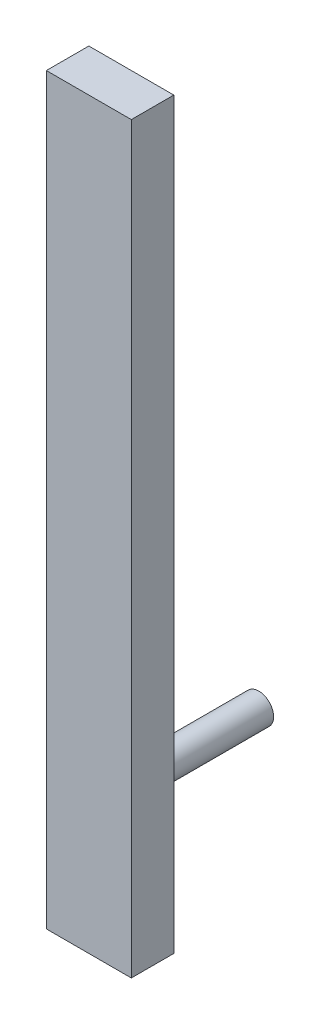
ISO-10303-21;
HEADER;
FILE_DESCRIPTION(('STEP AP214'),'2;1');
FILE_NAME('part.step','',(''),(''),'','','');
FILE_SCHEMA(('AUTOMOTIVE_DESIGN { 1 0 10303 214 1 1 1 1 }'));
ENDSEC;
DATA;
#1=APPLICATION_CONTEXT('core data for automotive mechanical design processes');
#2=APPLICATION_PROTOCOL_DEFINITION('international standard','automotive_design',2000,#1);
#3=PRODUCT_CONTEXT('',#1,'mechanical');
#4=PRODUCT('Part','Part','',(#3));
#5=PRODUCT_RELATED_PRODUCT_CATEGORY('part','',(#4));
#6=PRODUCT_DEFINITION_FORMATION('','',#4);
#7=PRODUCT_DEFINITION_CONTEXT('part definition',#1,'design');
#8=PRODUCT_DEFINITION('design','',#6,#7);
#9=PRODUCT_DEFINITION_SHAPE('','',#8);
#10=(LENGTH_UNIT() NAMED_UNIT(*) SI_UNIT(.MILLI.,.METRE.));
#11=(NAMED_UNIT(*) PLANE_ANGLE_UNIT() SI_UNIT($,.RADIAN.));
#12=(NAMED_UNIT(*) SI_UNIT($,.STERADIAN.) SOLID_ANGLE_UNIT());
#13=UNCERTAINTY_MEASURE_WITH_UNIT(LENGTH_MEASURE(1.E-05),#10,'distance_accuracy_value','');
#14=(GEOMETRIC_REPRESENTATION_CONTEXT(3) GLOBAL_UNCERTAINTY_ASSIGNED_CONTEXT((#13)) GLOBAL_UNIT_ASSIGNED_CONTEXT((#10,
#11,#12)) REPRESENTATION_CONTEXT('',''));
#15=CARTESIAN_POINT('',(0.,0.,0.));
#16=DIRECTION('',(0.,0.,1.));
#17=DIRECTION('',(1.,0.,0.));
#18=AXIS2_PLACEMENT_3D('',#15,#16,#17);
#19=CARTESIAN_POINT('',(161.317621290691,289.5,0.));
#20=DIRECTION('',(0.,0.,-1.));
#21=DIRECTION('',(-1.,0.,0.));
#22=AXIS2_PLACEMENT_3D('',#19,#20,#21);
#23=PLANE('',#22);
#24=DIRECTION('',(0.,-1.,0.));
#25=VECTOR('',#24,1.);
#26=CARTESIAN_POINT('',(161.317621290691,-60.5,0.));
#27=LINE('',#26,#25);
#28=CARTESIAN_POINT('',(161.317621290691,289.5,0.));
#29=VERTEX_POINT('',#28);
#30=CARTESIAN_POINT('',(161.317621290691,-60.5,0.));
#31=VERTEX_POINT('',#30);
#32=EDGE_CURVE('E78',#29,#31,#27,.T.);
#33=ORIENTED_EDGE('',*,*,#32,.F.);
#34=DIRECTION('',(-1.,0.,0.));
#35=VECTOR('',#34,1.);
#36=CARTESIAN_POINT('',(161.317621290691,289.5,0.));
#37=LINE('',#36,#35);
#38=CARTESIAN_POINT('',(201.317621290691,289.5,0.));
#39=VERTEX_POINT('',#38);
#40=EDGE_CURVE('E99',#39,#29,#37,.T.);
#41=ORIENTED_EDGE('',*,*,#40,.F.);
#42=DIRECTION('',(0.,1.,0.));
#43=VECTOR('',#42,1.);
#44=CARTESIAN_POINT('',(201.317621290691,-60.5,0.));
#45=LINE('',#44,#43);
#46=CARTESIAN_POINT('',(201.317621290691,-60.5,0.));
#47=VERTEX_POINT('',#46);
#48=EDGE_CURVE('E79',#47,#39,#45,.T.);
#49=ORIENTED_EDGE('',*,*,#48,.F.);
#50=DIRECTION('',(1.,0.,0.));
#51=VECTOR('',#50,1.);
#52=CARTESIAN_POINT('',(161.317621290691,-60.5,0.));
#53=LINE('',#52,#51);
#54=EDGE_CURVE('E74',#31,#47,#53,.T.);
#55=ORIENTED_EDGE('',*,*,#54,.F.);
#56=EDGE_LOOP('',(#33,#41,#49,#55));
#57=FACE_BOUND('',#56,.T.);
#58=CARTESIAN_POINT('',(181.317621290691,-0.499999999999997,0.));
#59=DIRECTION('',(0.,0.,-1.));
#60=DIRECTION('',(-1.,0.,0.));
#61=AXIS2_PLACEMENT_3D('',#58,#59,#60);
#62=CIRCLE('',#61,7.00000000000001);
#63=CARTESIAN_POINT('',(188.317621290691,-0.499999999999997,0.));
#64=VERTEX_POINT('',#63);
#65=EDGE_CURVE('E94',#64,#64,#62,.T.);
#66=ORIENTED_EDGE('',*,*,#65,.F.);
#67=EDGE_LOOP('',(#66));
#68=FACE_BOUND('',#67,.T.);
#69=ADVANCED_FACE('F33',(#57,#68),#23,.T.);
#70=CARTESIAN_POINT('',(161.317621290691,-60.5,20.));
#71=DIRECTION('',(1.,0.,0.));
#72=DIRECTION('',(0.,0.,-1.));
#73=AXIS2_PLACEMENT_3D('',#70,#71,#72);
#74=PLANE('',#73);
#75=ORIENTED_EDGE('',*,*,#32,.T.);
#76=DIRECTION('',(0.,0.,-1.));
#77=VECTOR('',#76,1.);
#78=CARTESIAN_POINT('',(161.317621290691,-60.5,20.));
#79=LINE('',#78,#77);
#80=CARTESIAN_POINT('',(161.317621290691,-60.5,20.));
#81=VERTEX_POINT('',#80);
#82=EDGE_CURVE('E11',#81,#31,#79,.T.);
#83=ORIENTED_EDGE('',*,*,#82,.F.);
#84=DIRECTION('',(0.,-1.,0.));
#85=VECTOR('',#84,1.);
#86=CARTESIAN_POINT('',(161.317621290691,-60.5,20.));
#87=LINE('',#86,#85);
#88=CARTESIAN_POINT('',(161.317621290691,289.5,20.));
#89=VERTEX_POINT('',#88);
#90=EDGE_CURVE('E101',#89,#81,#87,.T.);
#91=ORIENTED_EDGE('',*,*,#90,.F.);
#92=DIRECTION('',(0.,0.,-1.));
#93=VECTOR('',#92,1.);
#94=CARTESIAN_POINT('',(161.317621290691,289.5,20.));
#95=LINE('',#94,#93);
#96=EDGE_CURVE('E90',#89,#29,#95,.T.);
#97=ORIENTED_EDGE('',*,*,#96,.T.);
#98=EDGE_LOOP('',(#75,#83,#91,#97));
#99=FACE_BOUND('',#98,.T.);
#100=ADVANCED_FACE('F35',(#99),#74,.F.);
#101=CARTESIAN_POINT('',(161.317621290691,-60.5,20.));
#102=DIRECTION('',(0.,1.,0.));
#103=DIRECTION('',(0.,0.,1.));
#104=AXIS2_PLACEMENT_3D('',#101,#102,#103);
#105=PLANE('',#104);
#106=ORIENTED_EDGE('',*,*,#54,.T.);
#107=DIRECTION('',(0.,0.,-1.));
#108=VECTOR('',#107,1.);
#109=CARTESIAN_POINT('',(201.317621290691,-60.5,20.));
#110=LINE('',#109,#108);
#111=CARTESIAN_POINT('',(201.317621290691,-60.5,20.));
#112=VERTEX_POINT('',#111);
#113=EDGE_CURVE('E41',#112,#47,#110,.T.);
#114=ORIENTED_EDGE('',*,*,#113,.F.);
#115=DIRECTION('',(1.,0.,0.));
#116=VECTOR('',#115,1.);
#117=CARTESIAN_POINT('',(161.317621290691,-60.5,20.));
#118=LINE('',#117,#116);
#119=EDGE_CURVE('E86',#81,#112,#118,.T.);
#120=ORIENTED_EDGE('',*,*,#119,.F.);
#121=ORIENTED_EDGE('',*,*,#82,.T.);
#122=EDGE_LOOP('',(#106,#114,#120,#121));
#123=FACE_BOUND('',#122,.T.);
#124=ADVANCED_FACE('F85',(#123),#105,.F.);
#125=CARTESIAN_POINT('',(201.317621290691,-60.5,20.));
#126=DIRECTION('',(-1.,0.,0.));
#127=DIRECTION('',(0.,0.,1.));
#128=AXIS2_PLACEMENT_3D('',#125,#126,#127);
#129=PLANE('',#128);
#130=ORIENTED_EDGE('',*,*,#48,.T.);
#131=DIRECTION('',(0.,0.,-1.));
#132=VECTOR('',#131,1.);
#133=CARTESIAN_POINT('',(201.317621290691,289.5,20.));
#134=LINE('',#133,#132);
#135=CARTESIAN_POINT('',(201.317621290691,289.5,20.));
#136=VERTEX_POINT('',#135);
#137=EDGE_CURVE('E107',#136,#39,#134,.T.);
#138=ORIENTED_EDGE('',*,*,#137,.F.);
#139=DIRECTION('',(0.,1.,0.));
#140=VECTOR('',#139,1.);
#141=CARTESIAN_POINT('',(201.317621290691,-60.5,20.));
#142=LINE('',#141,#140);
#143=EDGE_CURVE('E53',#112,#136,#142,.T.);
#144=ORIENTED_EDGE('',*,*,#143,.F.);
#145=ORIENTED_EDGE('',*,*,#113,.T.);
#146=EDGE_LOOP('',(#130,#138,#144,#145));
#147=FACE_BOUND('',#146,.T.);
#148=ADVANCED_FACE('F110',(#147),#129,.F.);
#149=CARTESIAN_POINT('',(161.317621290691,289.5,20.));
#150=DIRECTION('',(0.,-1.,0.));
#151=DIRECTION('',(0.,0.,-1.));
#152=AXIS2_PLACEMENT_3D('',#149,#150,#151);
#153=PLANE('',#152);
#154=ORIENTED_EDGE('',*,*,#40,.T.);
#155=ORIENTED_EDGE('',*,*,#96,.F.);
#156=DIRECTION('',(-1.,0.,0.));
#157=VECTOR('',#156,1.);
#158=CARTESIAN_POINT('',(161.317621290691,289.5,20.));
#159=LINE('',#158,#157);
#160=EDGE_CURVE('E48',#136,#89,#159,.T.);
#161=ORIENTED_EDGE('',*,*,#160,.F.);
#162=ORIENTED_EDGE('',*,*,#137,.T.);
#163=EDGE_LOOP('',(#154,#155,#161,#162));
#164=FACE_BOUND('',#163,.T.);
#165=ADVANCED_FACE('F112',(#164),#153,.F.);
#166=CARTESIAN_POINT('',(161.317621290691,289.5,20.));
#167=DIRECTION('',(0.,0.,-1.));
#168=DIRECTION('',(-1.,0.,0.));
#169=AXIS2_PLACEMENT_3D('',#166,#167,#168);
#170=PLANE('',#169);
#171=ORIENTED_EDGE('',*,*,#90,.T.);
#172=ORIENTED_EDGE('',*,*,#119,.T.);
#173=ORIENTED_EDGE('',*,*,#143,.T.);
#174=ORIENTED_EDGE('',*,*,#160,.T.);
#175=EDGE_LOOP('',(#171,#172,#173,#174));
#176=FACE_BOUND('',#175,.T.);
#177=ADVANCED_FACE('F113',(#176),#170,.F.);
#178=CARTESIAN_POINT('',(181.317621290691,-0.499999999999997,-60.));
#179=DIRECTION('',(0.,0.,1.));
#180=DIRECTION('',(1.,0.,0.));
#181=AXIS2_PLACEMENT_3D('',#178,#179,#180);
#182=CYLINDRICAL_SURFACE('',#181,7.00000000000001);
#183=CARTESIAN_POINT('',(181.317621290691,-0.499999999999997,-60.));
#184=DIRECTION('',(0.,0.,-1.));
#185=DIRECTION('',(-1.,0.,0.));
#186=AXIS2_PLACEMENT_3D('',#183,#184,#185);
#187=CIRCLE('',#186,7.00000000000001);
#188=CARTESIAN_POINT('',(188.317621290691,-0.499999999999997,-60.));
#189=VERTEX_POINT('',#188);
#190=EDGE_CURVE('E91',#189,#189,#187,.T.);
#191=CARTESIAN_POINT('',(188.317621290691,-0.499999999999997,-60.));
#192=CARTESIAN_POINT('',(188.317621290691,-0.499999999999997,-59.375));
#193=CARTESIAN_POINT('',(188.317621290691,-0.499999999999997,-58.75));
#194=CARTESIAN_POINT('',(188.317621290691,-0.499999999999997,-57.5));
#195=CARTESIAN_POINT('',(188.317621290691,-0.499999999999997,-56.875));
#196=CARTESIAN_POINT('',(188.317621290691,-0.499999999999997,-55.625));
#197=CARTESIAN_POINT('',(188.317621290691,-0.499999999999997,-55.));
#198=CARTESIAN_POINT('',(188.317621290691,-0.499999999999997,-53.75));
#199=CARTESIAN_POINT('',(188.317621290691,-0.499999999999997,-53.125));
#200=CARTESIAN_POINT('',(188.317621290691,-0.499999999999997,-51.875));
#201=CARTESIAN_POINT('',(188.317621290691,-0.499999999999997,-51.25));
#202=CARTESIAN_POINT('',(188.317621290691,-0.499999999999997,-50.));
#203=CARTESIAN_POINT('',(188.317621290691,-0.499999999999997,-49.375));
#204=CARTESIAN_POINT('',(188.317621290691,-0.499999999999997,-48.125));
#205=CARTESIAN_POINT('',(188.317621290691,-0.499999999999997,-47.5));
#206=CARTESIAN_POINT('',(188.317621290691,-0.499999999999997,-46.25));
#207=CARTESIAN_POINT('',(188.317621290691,-0.499999999999997,-45.625));
#208=CARTESIAN_POINT('',(188.317621290691,-0.499999999999997,-44.375));
#209=CARTESIAN_POINT('',(188.317621290691,-0.499999999999997,-43.75));
#210=CARTESIAN_POINT('',(188.317621290691,-0.499999999999997,-42.5));
#211=CARTESIAN_POINT('',(188.317621290691,-0.499999999999997,-41.875));
#212=CARTESIAN_POINT('',(188.317621290691,-0.499999999999997,-40.625));
#213=CARTESIAN_POINT('',(188.317621290691,-0.499999999999997,-40.));
#214=CARTESIAN_POINT('',(188.317621290691,-0.499999999999997,-38.75));
#215=CARTESIAN_POINT('',(188.317621290691,-0.499999999999997,-38.125));
#216=CARTESIAN_POINT('',(188.317621290691,-0.499999999999997,-36.875));
#217=CARTESIAN_POINT('',(188.317621290691,-0.499999999999997,-36.25));
#218=CARTESIAN_POINT('',(188.317621290691,-0.499999999999997,-35.));
#219=CARTESIAN_POINT('',(188.317621290691,-0.499999999999997,-34.375));
#220=CARTESIAN_POINT('',(188.317621290691,-0.499999999999997,-33.125));
#221=CARTESIAN_POINT('',(188.317621290691,-0.499999999999997,-32.5));
#222=CARTESIAN_POINT('',(188.317621290691,-0.499999999999997,-31.25));
#223=CARTESIAN_POINT('',(188.317621290691,-0.499999999999997,-30.625));
#224=CARTESIAN_POINT('',(188.317621290691,-0.499999999999997,-29.375));
#225=CARTESIAN_POINT('',(188.317621290691,-0.499999999999997,-28.75));
#226=CARTESIAN_POINT('',(188.317621290691,-0.499999999999997,-27.5));
#227=CARTESIAN_POINT('',(188.317621290691,-0.499999999999997,-26.875));
#228=CARTESIAN_POINT('',(188.317621290691,-0.499999999999997,-25.625));
#229=CARTESIAN_POINT('',(188.317621290691,-0.499999999999997,-25.));
#230=CARTESIAN_POINT('',(188.317621290691,-0.499999999999997,-23.75));
#231=CARTESIAN_POINT('',(188.317621290691,-0.499999999999997,-23.125));
#232=CARTESIAN_POINT('',(188.317621290691,-0.499999999999997,-21.875));
#233=CARTESIAN_POINT('',(188.317621290691,-0.499999999999997,-21.25));
#234=CARTESIAN_POINT('',(188.317621290691,-0.499999999999997,-20.));
#235=CARTESIAN_POINT('',(188.317621290691,-0.499999999999997,-19.375));
#236=CARTESIAN_POINT('',(188.317621290691,-0.499999999999997,-18.125));
#237=CARTESIAN_POINT('',(188.317621290691,-0.499999999999997,-17.5));
#238=CARTESIAN_POINT('',(188.317621290691,-0.499999999999997,-16.25));
#239=CARTESIAN_POINT('',(188.317621290691,-0.499999999999997,-15.625));
#240=CARTESIAN_POINT('',(188.317621290691,-0.499999999999997,-14.375));
#241=CARTESIAN_POINT('',(188.317621290691,-0.499999999999997,-13.75));
#242=CARTESIAN_POINT('',(188.317621290691,-0.499999999999997,-12.5));
#243=CARTESIAN_POINT('',(188.317621290691,-0.499999999999997,-11.875));
#244=CARTESIAN_POINT('',(188.317621290691,-0.499999999999997,-10.625));
#245=CARTESIAN_POINT('',(188.317621290691,-0.499999999999997,-10.));
#246=CARTESIAN_POINT('',(188.317621290691,-0.499999999999997,-8.75));
#247=CARTESIAN_POINT('',(188.317621290691,-0.499999999999997,-8.125));
#248=CARTESIAN_POINT('',(188.317621290691,-0.499999999999997,-6.875));
#249=CARTESIAN_POINT('',(188.317621290691,-0.499999999999997,-6.25));
#250=CARTESIAN_POINT('',(188.317621290691,-0.499999999999997,-5.));
#251=CARTESIAN_POINT('',(188.317621290691,-0.499999999999997,-4.375));
#252=CARTESIAN_POINT('',(188.317621290691,-0.499999999999997,-3.125));
#253=CARTESIAN_POINT('',(188.317621290691,-0.499999999999997,-2.5));
#254=CARTESIAN_POINT('',(188.317621290691,-0.499999999999997,-1.25));
#255=CARTESIAN_POINT('',(188.317621290691,-0.499999999999997,-0.625000000000001));
#256=CARTESIAN_POINT('',(188.317621290691,-0.499999999999997,0.));
#257=B_SPLINE_CURVE_WITH_KNOTS('',3,(#191,#192,#193,#194,#195,#196,#197,#198,#199,#200,#201,
#202,#203,#204,#205,#206,#207,#208,#209,#210,#211,#212,#213,#214,#215,#216,#217,#218,#219,#220,
#221,#222,#223,#224,#225,#226,#227,#228,#229,#230,#231,#232,#233,#234,#235,#236,#237,#238,#239,
#240,#241,#242,#243,#244,#245,#246,#247,#248,#249,#250,#251,#252,#253,#254,#255,#256),
.UNSPECIFIED.,.F.,.F.,(4,2,2,2,2,2,2,2,2,2,2,2,2,2,2,2,2,2,2,2,2,2,2,2,2,2,2,2,2,2,2,2,4),(0.,
1.87499999999999,3.75,5.625,7.49999999999999,9.37499999999999,11.25,13.125,15.,16.875,18.75,
20.625,22.5,24.375,26.25,28.125,30.,31.875,33.75,35.625,37.5,39.375,41.25,43.125,45.,46.875,
48.75,50.625,52.5,54.375,56.25,58.125,60.),.UNSPECIFIED.);
#258=EDGE_CURVE('BSEAM115',#189,#64,#257,.T.);
#259=ORIENTED_EDGE('',*,*,#190,.F.);
#260=ORIENTED_EDGE('',*,*,#65,.T.);
#261=ORIENTED_EDGE('',*,*,#258,.T.);
#262=ORIENTED_EDGE('',*,*,#258,.F.);
#263=EDGE_LOOP('',(#259,#261,#260,#262));
#264=FACE_BOUND('',#263,.T.);
#265=ADVANCED_FACE('F115',(#264),#182,.T.);
#266=CARTESIAN_POINT('',(181.317621290691,-0.499999999999997,-60.));
#267=DIRECTION('',(0.,0.,-1.));
#268=DIRECTION('',(-1.,0.,0.));
#269=AXIS2_PLACEMENT_3D('',#266,#267,#268);
#270=PLANE('',#269);
#271=ORIENTED_EDGE('',*,*,#190,.T.);
#272=EDGE_LOOP('',(#271));
#273=FACE_BOUND('',#272,.T.);
#274=ADVANCED_FACE('F121',(#273),#270,.T.);
#275=CLOSED_SHELL('',(#69,#100,#124,#148,#165,#177,#265,#274));
#276=MANIFOLD_SOLID_BREP('B2',#275);
#277=ADVANCED_BREP_SHAPE_REPRESENTATION('',(#18,#276),#14);
#278=SHAPE_DEFINITION_REPRESENTATION(#9,#277);
ENDSEC;
END-ISO-10303-21;
